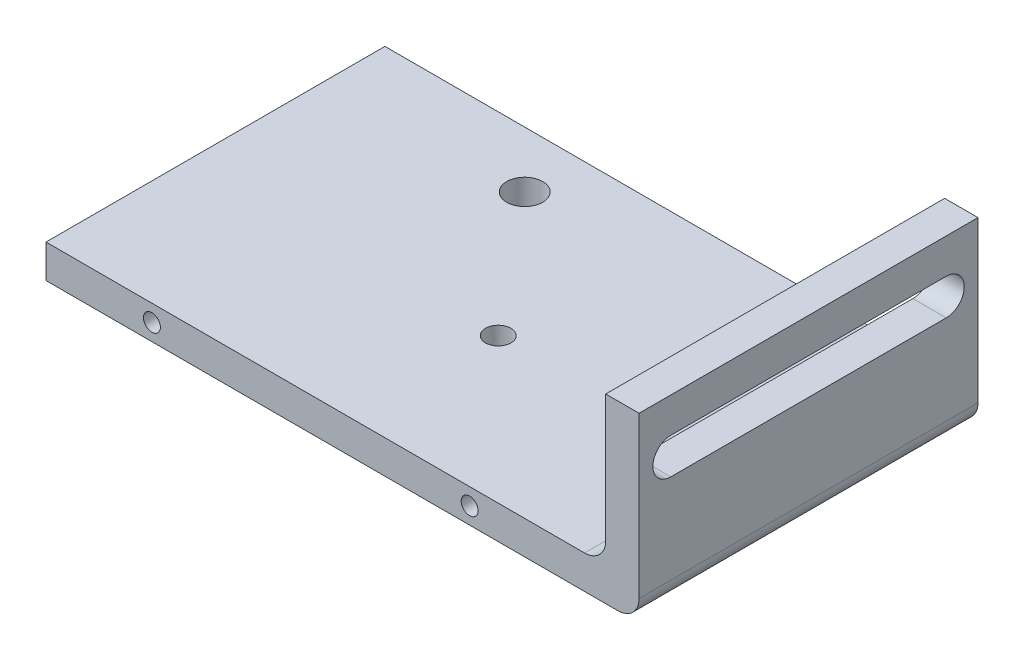
ISO-10303-21;
HEADER;
FILE_DESCRIPTION(('STEP AP214'),'2;1');
FILE_NAME('part.step','',(''),(''),'','','');
FILE_SCHEMA(('AUTOMOTIVE_DESIGN { 1 0 10303 214 1 1 1 1 }'));
ENDSEC;
DATA;
#1=APPLICATION_CONTEXT('core data for automotive mechanical design processes');
#2=APPLICATION_PROTOCOL_DEFINITION('international standard','automotive_design',2000,#1);
#3=PRODUCT_CONTEXT('',#1,'mechanical');
#4=PRODUCT('Part','Part','',(#3));
#5=PRODUCT_RELATED_PRODUCT_CATEGORY('part','',(#4));
#6=PRODUCT_DEFINITION_FORMATION('','',#4);
#7=PRODUCT_DEFINITION_CONTEXT('part definition',#1,'design');
#8=PRODUCT_DEFINITION('design','',#6,#7);
#9=PRODUCT_DEFINITION_SHAPE('','',#8);
#10=(LENGTH_UNIT() NAMED_UNIT(*) SI_UNIT(.MILLI.,.METRE.));
#11=(NAMED_UNIT(*) PLANE_ANGLE_UNIT() SI_UNIT($,.RADIAN.));
#12=(NAMED_UNIT(*) SI_UNIT($,.STERADIAN.) SOLID_ANGLE_UNIT());
#13=UNCERTAINTY_MEASURE_WITH_UNIT(LENGTH_MEASURE(1.E-05),#10,'distance_accuracy_value','');
#14=(GEOMETRIC_REPRESENTATION_CONTEXT(3) GLOBAL_UNCERTAINTY_ASSIGNED_CONTEXT((#13)) GLOBAL_UNIT_ASSIGNED_CONTEXT((#10,
#11,#12)) REPRESENTATION_CONTEXT('',''));
#15=CARTESIAN_POINT('',(0.,0.,0.));
#16=DIRECTION('',(0.,0.,1.));
#17=DIRECTION('',(1.,0.,0.));
#18=AXIS2_PLACEMENT_3D('',#15,#16,#17);
#19=CARTESIAN_POINT('',(-35.5,3.15,-16.));
#20=DIRECTION('',(0.,0.,1.));
#21=DIRECTION('',(1.,0.,0.));
#22=AXIS2_PLACEMENT_3D('',#19,#20,#21);
#23=PLANE('',#22);
#24=CARTESIAN_POINT('',(-10.5,1.575,-16.));
#25=DIRECTION('',(0.,0.,-1.));
#26=DIRECTION('',(-1.,0.,0.));
#27=AXIS2_PLACEMENT_3D('',#24,#25,#26);
#28=CIRCLE('',#27,0.79999999999999);
#29=CARTESIAN_POINT('',(-11.3,1.575,-16.));
#30=VERTEX_POINT('',#29);
#31=EDGE_CURVE('E153',#30,#30,#28,.T.);
#32=ORIENTED_EDGE('',*,*,#31,.F.);
#33=EDGE_LOOP('',(#32));
#34=FACE_BOUND('',#33,.T.);
#35=CARTESIAN_POINT('',(19.5,1.575,-16.));
#36=DIRECTION('',(0.,0.,-1.));
#37=DIRECTION('',(-1.,0.,0.));
#38=AXIS2_PLACEMENT_3D('',#35,#36,#37);
#39=CIRCLE('',#38,0.799999999999999);
#40=CARTESIAN_POINT('',(18.7,1.575,-16.));
#41=VERTEX_POINT('',#40);
#42=EDGE_CURVE('E184',#41,#41,#39,.T.);
#43=ORIENTED_EDGE('',*,*,#42,.F.);
#44=EDGE_LOOP('',(#43));
#45=FACE_BOUND('',#44,.T.);
#46=DIRECTION('',(0.,-1.,0.));
#47=VECTOR('',#46,1.);
#48=CARTESIAN_POINT('',(-20.5,3.15,-16.));
#49=LINE('',#48,#47);
#50=CARTESIAN_POINT('',(-20.5,3.15,-16.));
#51=VERTEX_POINT('',#50);
#52=CARTESIAN_POINT('',(-20.5,0.,-16.));
#53=VERTEX_POINT('',#52);
#54=EDGE_CURVE('E58',#51,#53,#49,.T.);
#55=ORIENTED_EDGE('',*,*,#54,.F.);
#56=DIRECTION('',(-1.,0.,0.));
#57=VECTOR('',#56,1.);
#58=CARTESIAN_POINT('',(-35.5,3.15,-16.));
#59=LINE('',#58,#57);
#60=CARTESIAN_POINT('',(30.35,3.15,-16.));
#61=VERTEX_POINT('',#60);
#62=EDGE_CURVE('E228',#61,#51,#59,.T.);
#63=ORIENTED_EDGE('',*,*,#62,.F.);
#64=CARTESIAN_POINT('',(30.35,5.15,-16.));
#65=DIRECTION('',(0.,0.,1.));
#66=DIRECTION('',(1.,0.,0.));
#67=AXIS2_PLACEMENT_3D('',#64,#65,#66);
#68=CIRCLE('',#67,2.);
#69=CARTESIAN_POINT('',(32.35,5.15,-16.));
#70=VERTEX_POINT('',#69);
#71=EDGE_CURVE('E250',#61,#70,#68,.T.);
#72=ORIENTED_EDGE('',*,*,#71,.T.);
#73=DIRECTION('',(0.,-1.,0.));
#74=VECTOR('',#73,1.);
#75=CARTESIAN_POINT('',(32.35,17.15,-16.));
#76=LINE('',#75,#74);
#77=CARTESIAN_POINT('',(32.35,17.15,-16.));
#78=VERTEX_POINT('',#77);
#79=EDGE_CURVE('E327',#78,#70,#76,.T.);
#80=ORIENTED_EDGE('',*,*,#79,.F.);
#81=DIRECTION('',(-1.,0.,0.));
#82=VECTOR('',#81,1.);
#83=CARTESIAN_POINT('',(35.5,17.15,-16.));
#84=LINE('',#83,#82);
#85=CARTESIAN_POINT('',(35.5,17.15,-16.));
#86=VERTEX_POINT('',#85);
#87=EDGE_CURVE('E219',#86,#78,#84,.T.);
#88=ORIENTED_EDGE('',*,*,#87,.F.);
#89=DIRECTION('',(0.,-1.,0.));
#90=VECTOR('',#89,1.);
#91=CARTESIAN_POINT('',(35.5,3.15,-16.));
#92=LINE('',#91,#90);
#93=CARTESIAN_POINT('',(35.5,2.,-16.));
#94=VERTEX_POINT('',#93);
#95=EDGE_CURVE('E339',#86,#94,#92,.T.);
#96=ORIENTED_EDGE('',*,*,#95,.T.);
#97=CARTESIAN_POINT('',(33.5,2.,-16.));
#98=DIRECTION('',(0.,0.,1.));
#99=DIRECTION('',(1.,0.,0.));
#100=AXIS2_PLACEMENT_3D('',#97,#98,#99);
#101=CIRCLE('',#100,2.);
#102=CARTESIAN_POINT('',(33.5,0.,-16.));
#103=VERTEX_POINT('',#102);
#104=EDGE_CURVE('E240',#94,#103,#101,.F.);
#105=ORIENTED_EDGE('',*,*,#104,.T.);
#106=DIRECTION('',(-1.,0.,0.));
#107=VECTOR('',#106,1.);
#108=CARTESIAN_POINT('',(-35.5,0.,-16.));
#109=LINE('',#108,#107);
#110=EDGE_CURVE('E331',#103,#53,#109,.T.);
#111=ORIENTED_EDGE('',*,*,#110,.T.);
#112=EDGE_LOOP('',(#55,#63,#72,#80,#88,#96,#105,#111));
#113=FACE_BOUND('',#112,.T.);
#114=ADVANCED_FACE('F41',(#34,#45,#113),#23,.F.);
#115=CARTESIAN_POINT('',(-35.5,3.15,16.));
#116=DIRECTION('',(0.,0.,-1.));
#117=DIRECTION('',(-1.,0.,0.));
#118=AXIS2_PLACEMENT_3D('',#115,#116,#117);
#119=PLANE('',#118);
#120=CARTESIAN_POINT('',(-10.5,1.575,16.));
#121=DIRECTION('',(0.,0.,1.));
#122=DIRECTION('',(1.,0.,0.));
#123=AXIS2_PLACEMENT_3D('',#120,#121,#122);
#124=CIRCLE('',#123,0.79999999999999);
#125=CARTESIAN_POINT('',(-9.70000000000003,1.575,16.));
#126=VERTEX_POINT('',#125);
#127=EDGE_CURVE('E154',#126,#126,#124,.T.);
#128=ORIENTED_EDGE('',*,*,#127,.F.);
#129=EDGE_LOOP('',(#128));
#130=FACE_BOUND('',#129,.T.);
#131=CARTESIAN_POINT('',(19.5,1.575,16.));
#132=DIRECTION('',(0.,0.,1.));
#133=DIRECTION('',(1.,0.,0.));
#134=AXIS2_PLACEMENT_3D('',#131,#132,#133);
#135=CIRCLE('',#134,0.799999999999999);
#136=CARTESIAN_POINT('',(20.3,1.575,16.));
#137=VERTEX_POINT('',#136);
#138=EDGE_CURVE('E195',#137,#137,#135,.T.);
#139=ORIENTED_EDGE('',*,*,#138,.F.);
#140=EDGE_LOOP('',(#139));
#141=FACE_BOUND('',#140,.T.);
#142=DIRECTION('',(0.,1.,0.));
#143=VECTOR('',#142,1.);
#144=CARTESIAN_POINT('',(-20.5,3.15,16.));
#145=LINE('',#144,#143);
#146=CARTESIAN_POINT('',(-20.5,0.,16.));
#147=VERTEX_POINT('',#146);
#148=CARTESIAN_POINT('',(-20.5,3.15,16.));
#149=VERTEX_POINT('',#148);
#150=EDGE_CURVE('E167',#147,#149,#145,.T.);
#151=ORIENTED_EDGE('',*,*,#150,.F.);
#152=DIRECTION('',(1.,0.,0.));
#153=VECTOR('',#152,1.);
#154=CARTESIAN_POINT('',(-35.5,0.,16.));
#155=LINE('',#154,#153);
#156=CARTESIAN_POINT('',(33.5,0.,16.));
#157=VERTEX_POINT('',#156);
#158=EDGE_CURVE('E232',#147,#157,#155,.T.);
#159=ORIENTED_EDGE('',*,*,#158,.T.);
#160=CARTESIAN_POINT('',(33.5,2.,16.));
#161=DIRECTION('',(0.,0.,-1.));
#162=DIRECTION('',(-1.,0.,0.));
#163=AXIS2_PLACEMENT_3D('',#160,#161,#162);
#164=CIRCLE('',#163,2.);
#165=CARTESIAN_POINT('',(35.5,2.,16.));
#166=VERTEX_POINT('',#165);
#167=EDGE_CURVE('E245',#157,#166,#164,.F.);
#168=ORIENTED_EDGE('',*,*,#167,.T.);
#169=DIRECTION('',(0.,-1.,0.));
#170=VECTOR('',#169,1.);
#171=CARTESIAN_POINT('',(35.5,3.15,16.));
#172=LINE('',#171,#170);
#173=CARTESIAN_POINT('',(35.5,17.15,16.));
#174=VERTEX_POINT('',#173);
#175=EDGE_CURVE('E342',#174,#166,#172,.T.);
#176=ORIENTED_EDGE('',*,*,#175,.F.);
#177=DIRECTION('',(1.,0.,0.));
#178=VECTOR('',#177,1.);
#179=CARTESIAN_POINT('',(35.5,17.15,16.));
#180=LINE('',#179,#178);
#181=CARTESIAN_POINT('',(32.35,17.15,16.));
#182=VERTEX_POINT('',#181);
#183=EDGE_CURVE('E213',#182,#174,#180,.T.);
#184=ORIENTED_EDGE('',*,*,#183,.F.);
#185=DIRECTION('',(0.,-1.,0.));
#186=VECTOR('',#185,1.);
#187=CARTESIAN_POINT('',(32.35,17.15,16.));
#188=LINE('',#187,#186);
#189=CARTESIAN_POINT('',(32.35,5.15,16.));
#190=VERTEX_POINT('',#189);
#191=EDGE_CURVE('E223',#182,#190,#188,.T.);
#192=ORIENTED_EDGE('',*,*,#191,.T.);
#193=CARTESIAN_POINT('',(30.35,5.15,16.));
#194=DIRECTION('',(0.,0.,-1.));
#195=DIRECTION('',(-1.,0.,0.));
#196=AXIS2_PLACEMENT_3D('',#193,#194,#195);
#197=CIRCLE('',#196,2.);
#198=CARTESIAN_POINT('',(30.35,3.15,16.));
#199=VERTEX_POINT('',#198);
#200=EDGE_CURVE('E247',#190,#199,#197,.T.);
#201=ORIENTED_EDGE('',*,*,#200,.T.);
#202=DIRECTION('',(1.,0.,0.));
#203=VECTOR('',#202,1.);
#204=CARTESIAN_POINT('',(-35.5,3.15,16.));
#205=LINE('',#204,#203);
#206=EDGE_CURVE('E45',#149,#199,#205,.T.);
#207=ORIENTED_EDGE('',*,*,#206,.F.);
#208=EDGE_LOOP('',(#151,#159,#168,#176,#184,#192,#201,#207));
#209=FACE_BOUND('',#208,.T.);
#210=ADVANCED_FACE('F291',(#130,#141,#209),#119,.F.);
#211=CARTESIAN_POINT('',(0.,3.15,0.));
#212=DIRECTION('',(0.,1.,0.));
#213=DIRECTION('',(0.,0.,1.));
#214=AXIS2_PLACEMENT_3D('',#211,#212,#213);
#215=PLANE('',#214);
#216=CARTESIAN_POINT('',(-2.00000000000002,3.15,-10.7));
#217=DIRECTION('',(0.,1.,0.));
#218=DIRECTION('',(0.,0.,1.));
#219=AXIS2_PLACEMENT_3D('',#216,#217,#218);
#220=CIRCLE('',#219,1.7);
#221=CARTESIAN_POINT('',(-2.00000000000002,3.15,-9.));
#222=VERTEX_POINT('',#221);
#223=EDGE_CURVE('E210',#222,#222,#220,.T.);
#224=ORIENTED_EDGE('',*,*,#223,.F.);
#225=EDGE_LOOP('',(#224));
#226=FACE_BOUND('',#225,.T.);
#227=CARTESIAN_POINT('',(8.49999999999999,3.15,2.3));
#228=DIRECTION('',(0.,1.,0.));
#229=DIRECTION('',(0.,0.,1.));
#230=AXIS2_PLACEMENT_3D('',#227,#228,#229);
#231=CIRCLE('',#230,1.2);
#232=CARTESIAN_POINT('',(8.49999999999999,3.15,3.5));
#233=VERTEX_POINT('',#232);
#234=EDGE_CURVE('E204',#233,#233,#231,.T.);
#235=ORIENTED_EDGE('',*,*,#234,.F.);
#236=EDGE_LOOP('',(#235));
#237=FACE_BOUND('',#236,.T.);
#238=ORIENTED_EDGE('',*,*,#62,.T.);
#239=DIRECTION('',(0.,0.,-1.));
#240=VECTOR('',#239,1.);
#241=CARTESIAN_POINT('',(-20.5,3.15,-16.));
#242=LINE('',#241,#240);
#243=EDGE_CURVE('E169',#149,#51,#242,.T.);
#244=ORIENTED_EDGE('',*,*,#243,.F.);
#245=ORIENTED_EDGE('',*,*,#206,.T.);
#246=DIRECTION('',(0.,0.,1.));
#247=VECTOR('',#246,1.);
#248=CARTESIAN_POINT('',(30.35,3.15,0.));
#249=LINE('',#248,#247);
#250=EDGE_CURVE('E235',#199,#61,#249,.F.);
#251=ORIENTED_EDGE('',*,*,#250,.T.);
#252=EDGE_LOOP('',(#238,#244,#245,#251));
#253=FACE_BOUND('',#252,.T.);
#254=ADVANCED_FACE('F297',(#226,#237,#253),#215,.T.);
#255=CARTESIAN_POINT('',(0.,0.,0.));
#256=DIRECTION('',(0.,1.,0.));
#257=DIRECTION('',(0.,0.,1.));
#258=AXIS2_PLACEMENT_3D('',#255,#256,#257);
#259=PLANE('',#258);
#260=CARTESIAN_POINT('',(-2.00000000000002,0.,-10.7));
#261=DIRECTION('',(0.,-1.,0.));
#262=DIRECTION('',(0.,0.,-1.));
#263=AXIS2_PLACEMENT_3D('',#260,#261,#262);
#264=CIRCLE('',#263,1.7);
#265=CARTESIAN_POINT('',(-2.00000000000002,0.,-12.4));
#266=VERTEX_POINT('',#265);
#267=EDGE_CURVE('E207',#266,#266,#264,.T.);
#268=ORIENTED_EDGE('',*,*,#267,.F.);
#269=EDGE_LOOP('',(#268));
#270=FACE_BOUND('',#269,.T.);
#271=CARTESIAN_POINT('',(8.49999999999999,0.,2.3));
#272=DIRECTION('',(0.,-1.,0.));
#273=DIRECTION('',(0.,0.,-1.));
#274=AXIS2_PLACEMENT_3D('',#271,#272,#273);
#275=CIRCLE('',#274,1.2);
#276=CARTESIAN_POINT('',(8.49999999999999,0.,1.1));
#277=VERTEX_POINT('',#276);
#278=EDGE_CURVE('E201',#277,#277,#275,.T.);
#279=ORIENTED_EDGE('',*,*,#278,.F.);
#280=EDGE_LOOP('',(#279));
#281=FACE_BOUND('',#280,.T.);
#282=DIRECTION('',(0.,0.,1.));
#283=VECTOR('',#282,1.);
#284=CARTESIAN_POINT('',(-20.5,0.,-16.));
#285=LINE('',#284,#283);
#286=EDGE_CURVE('E165',#53,#147,#285,.T.);
#287=ORIENTED_EDGE('',*,*,#286,.F.);
#288=ORIENTED_EDGE('',*,*,#110,.F.);
#289=DIRECTION('',(0.,0.,-1.));
#290=VECTOR('',#289,1.);
#291=CARTESIAN_POINT('',(33.5,0.,0.));
#292=LINE('',#291,#290);
#293=EDGE_CURVE('E242',#103,#157,#292,.F.);
#294=ORIENTED_EDGE('',*,*,#293,.T.);
#295=ORIENTED_EDGE('',*,*,#158,.F.);
#296=EDGE_LOOP('',(#287,#288,#294,#295));
#297=FACE_BOUND('',#296,.T.);
#298=ADVANCED_FACE('F305',(#270,#281,#297),#259,.F.);
#299=CARTESIAN_POINT('',(35.5,3.15,-16.));
#300=DIRECTION('',(-1.,0.,0.));
#301=DIRECTION('',(0.,0.,1.));
#302=AXIS2_PLACEMENT_3D('',#299,#300,#301);
#303=PLANE('',#302);
#304=DIRECTION('',(0.,0.,-1.));
#305=VECTOR('',#304,1.);
#306=CARTESIAN_POINT('',(35.5,10.45,13.));
#307=LINE('',#306,#305);
#308=CARTESIAN_POINT('',(35.5,10.45,13.));
#309=VERTEX_POINT('',#308);
#310=CARTESIAN_POINT('',(35.5,10.45,-13.));
#311=VERTEX_POINT('',#310);
#312=EDGE_CURVE('E172',#309,#311,#307,.T.);
#313=ORIENTED_EDGE('',*,*,#312,.F.);
#314=CARTESIAN_POINT('',(35.5,12.15,13.));
#315=DIRECTION('',(1.,0.,0.));
#316=DIRECTION('',(0.,0.,-1.));
#317=AXIS2_PLACEMENT_3D('',#314,#315,#316);
#318=CIRCLE('',#317,1.7);
#319=CARTESIAN_POINT('',(35.5,13.85,13.));
#320=VERTEX_POINT('',#319);
#321=EDGE_CURVE('E66',#320,#309,#318,.T.);
#322=ORIENTED_EDGE('',*,*,#321,.F.);
#323=DIRECTION('',(0.,0.,1.));
#324=VECTOR('',#323,1.);
#325=CARTESIAN_POINT('',(35.5,13.85,13.));
#326=LINE('',#325,#324);
#327=CARTESIAN_POINT('',(35.5,13.85,-13.));
#328=VERTEX_POINT('',#327);
#329=EDGE_CURVE('E178',#328,#320,#326,.T.);
#330=ORIENTED_EDGE('',*,*,#329,.F.);
#331=CARTESIAN_POINT('',(35.5,12.15,-13.));
#332=DIRECTION('',(1.,0.,0.));
#333=DIRECTION('',(0.,0.,-1.));
#334=AXIS2_PLACEMENT_3D('',#331,#332,#333);
#335=CIRCLE('',#334,1.7);
#336=EDGE_CURVE('E175',#311,#328,#335,.T.);
#337=ORIENTED_EDGE('',*,*,#336,.F.);
#338=EDGE_LOOP('',(#313,#322,#330,#337));
#339=FACE_BOUND('',#338,.T.);
#340=ORIENTED_EDGE('',*,*,#175,.T.);
#341=DIRECTION('',(0.,0.,-1.));
#342=VECTOR('',#341,1.);
#343=CARTESIAN_POINT('',(35.5,2.,-16.));
#344=LINE('',#343,#342);
#345=EDGE_CURVE('E237',#166,#94,#344,.T.);
#346=ORIENTED_EDGE('',*,*,#345,.T.);
#347=ORIENTED_EDGE('',*,*,#95,.F.);
#348=DIRECTION('',(0.,0.,-1.));
#349=VECTOR('',#348,1.);
#350=CARTESIAN_POINT('',(35.5,17.15,16.));
#351=LINE('',#350,#349);
#352=EDGE_CURVE('E216',#174,#86,#351,.T.);
#353=ORIENTED_EDGE('',*,*,#352,.F.);
#354=EDGE_LOOP('',(#340,#346,#347,#353));
#355=FACE_BOUND('',#354,.T.);
#356=ADVANCED_FACE('F273',(#339,#355),#303,.F.);
#357=CARTESIAN_POINT('',(32.35,17.15,16.));
#358=DIRECTION('',(1.,0.,0.));
#359=DIRECTION('',(0.,0.,-1.));
#360=AXIS2_PLACEMENT_3D('',#357,#358,#359);
#361=PLANE('',#360);
#362=DIRECTION('',(0.,0.,1.));
#363=VECTOR('',#362,1.);
#364=CARTESIAN_POINT('',(32.35,13.85,16.));
#365=LINE('',#364,#363);
#366=CARTESIAN_POINT('',(32.35,13.85,-13.));
#367=VERTEX_POINT('',#366);
#368=CARTESIAN_POINT('',(32.35,13.85,13.));
#369=VERTEX_POINT('',#368);
#370=EDGE_CURVE('E51',#367,#369,#365,.T.);
#371=ORIENTED_EDGE('',*,*,#370,.T.);
#372=CARTESIAN_POINT('',(32.35,12.15,13.));
#373=DIRECTION('',(1.,0.,0.));
#374=DIRECTION('',(0.,0.,-1.));
#375=AXIS2_PLACEMENT_3D('',#372,#373,#374);
#376=CIRCLE('',#375,1.7);
#377=CARTESIAN_POINT('',(32.35,10.45,13.));
#378=VERTEX_POINT('',#377);
#379=EDGE_CURVE('E11',#369,#378,#376,.T.);
#380=ORIENTED_EDGE('',*,*,#379,.T.);
#381=DIRECTION('',(0.,0.,-1.));
#382=VECTOR('',#381,1.);
#383=CARTESIAN_POINT('',(32.35,10.45,16.));
#384=LINE('',#383,#382);
#385=CARTESIAN_POINT('',(32.35,10.45,-13.));
#386=VERTEX_POINT('',#385);
#387=EDGE_CURVE('E252',#378,#386,#384,.T.);
#388=ORIENTED_EDGE('',*,*,#387,.T.);
#389=CARTESIAN_POINT('',(32.35,12.15,-13.));
#390=DIRECTION('',(1.,0.,0.));
#391=DIRECTION('',(0.,0.,-1.));
#392=AXIS2_PLACEMENT_3D('',#389,#390,#391);
#393=CIRCLE('',#392,1.7);
#394=EDGE_CURVE('E255',#386,#367,#393,.T.);
#395=ORIENTED_EDGE('',*,*,#394,.T.);
#396=EDGE_LOOP('',(#371,#380,#388,#395));
#397=FACE_BOUND('',#396,.T.);
#398=ORIENTED_EDGE('',*,*,#79,.T.);
#399=DIRECTION('',(0.,0.,1.));
#400=VECTOR('',#399,1.);
#401=CARTESIAN_POINT('',(32.35,5.15,16.));
#402=LINE('',#401,#400);
#403=EDGE_CURVE('E233',#70,#190,#402,.T.);
#404=ORIENTED_EDGE('',*,*,#403,.T.);
#405=ORIENTED_EDGE('',*,*,#191,.F.);
#406=DIRECTION('',(0.,0.,1.));
#407=VECTOR('',#406,1.);
#408=CARTESIAN_POINT('',(32.35,17.15,16.));
#409=LINE('',#408,#407);
#410=EDGE_CURVE('E221',#78,#182,#409,.T.);
#411=ORIENTED_EDGE('',*,*,#410,.F.);
#412=EDGE_LOOP('',(#398,#404,#405,#411));
#413=FACE_BOUND('',#412,.T.);
#414=ADVANCED_FACE('F260',(#397,#413),#361,.F.);
#415=CARTESIAN_POINT('',(0.,17.15,0.));
#416=DIRECTION('',(0.,-1.,0.));
#417=DIRECTION('',(0.,0.,-1.));
#418=AXIS2_PLACEMENT_3D('',#415,#416,#417);
#419=PLANE('',#418);
#420=ORIENTED_EDGE('',*,*,#183,.T.);
#421=ORIENTED_EDGE('',*,*,#352,.T.);
#422=ORIENTED_EDGE('',*,*,#87,.T.);
#423=ORIENTED_EDGE('',*,*,#410,.T.);
#424=EDGE_LOOP('',(#420,#421,#422,#423));
#425=FACE_BOUND('',#424,.T.);
#426=ADVANCED_FACE('F308',(#425),#419,.F.);
#427=CARTESIAN_POINT('',(30.35,5.15,16.));
#428=DIRECTION('',(0.,0.,1.));
#429=DIRECTION('',(1.,0.,0.));
#430=AXIS2_PLACEMENT_3D('',#427,#428,#429);
#431=CYLINDRICAL_SURFACE('',#430,2.);
#432=ORIENTED_EDGE('',*,*,#71,.F.);
#433=ORIENTED_EDGE('',*,*,#250,.F.);
#434=ORIENTED_EDGE('',*,*,#200,.F.);
#435=ORIENTED_EDGE('',*,*,#403,.F.);
#436=EDGE_LOOP('',(#432,#433,#434,#435));
#437=FACE_BOUND('',#436,.T.);
#438=ADVANCED_FACE('F306',(#437),#431,.F.);
#439=CARTESIAN_POINT('',(33.5,2.,-16.));
#440=DIRECTION('',(0.,0.,-1.));
#441=DIRECTION('',(-1.,0.,0.));
#442=AXIS2_PLACEMENT_3D('',#439,#440,#441);
#443=CYLINDRICAL_SURFACE('',#442,2.);
#444=ORIENTED_EDGE('',*,*,#167,.F.);
#445=ORIENTED_EDGE('',*,*,#293,.F.);
#446=ORIENTED_EDGE('',*,*,#104,.F.);
#447=ORIENTED_EDGE('',*,*,#345,.F.);
#448=EDGE_LOOP('',(#444,#445,#446,#447));
#449=FACE_BOUND('',#448,.T.);
#450=ADVANCED_FACE('F43',(#449),#443,.T.);
#451=CARTESIAN_POINT('',(-2.00000000000002,17.15,-10.7));
#452=DIRECTION('',(0.,-1.,0.));
#453=DIRECTION('',(0.,0.,-1.));
#454=AXIS2_PLACEMENT_3D('',#451,#452,#453);
#455=CYLINDRICAL_SURFACE('',#454,1.7);
#456=ORIENTED_EDGE('',*,*,#223,.T.);
#457=EDGE_LOOP('',(#456));
#458=FACE_BOUND('',#457,.T.);
#459=ORIENTED_EDGE('',*,*,#267,.T.);
#460=EDGE_LOOP('',(#459));
#461=FACE_BOUND('',#460,.T.);
#462=ADVANCED_FACE('F314',(#458,#461),#455,.F.);
#463=CARTESIAN_POINT('',(8.49999999999999,17.15,2.3));
#464=DIRECTION('',(0.,-1.,0.));
#465=DIRECTION('',(0.,0.,-1.));
#466=AXIS2_PLACEMENT_3D('',#463,#464,#465);
#467=CYLINDRICAL_SURFACE('',#466,1.2);
#468=ORIENTED_EDGE('',*,*,#234,.T.);
#469=EDGE_LOOP('',(#468));
#470=FACE_BOUND('',#469,.T.);
#471=ORIENTED_EDGE('',*,*,#278,.T.);
#472=EDGE_LOOP('',(#471));
#473=FACE_BOUND('',#472,.T.);
#474=ADVANCED_FACE('F534',(#470,#473),#467,.F.);
#475=CARTESIAN_POINT('',(19.5,1.575,10.8));
#476=DIRECTION('',(0.,0.,1.));
#477=DIRECTION('',(1.,0.,0.));
#478=AXIS2_PLACEMENT_3D('',#475,#476,#477);
#479=CONICAL_SURFACE('',#478,0.799999999999999,1.02974425867665);
#480=CARTESIAN_POINT('',(19.5,1.575,10.319311504778));
#481=VERTEX_POINT('',#480);
#482=VERTEX_LOOP('',#481);
#483=FACE_BOUND('',#482,.T.);
#484=CARTESIAN_POINT('',(19.5,1.575,10.8));
#485=DIRECTION('',(0.,0.,1.));
#486=DIRECTION('',(1.,0.,0.));
#487=AXIS2_PLACEMENT_3D('',#484,#485,#486);
#488=CIRCLE('',#487,0.799999999999999);
#489=CARTESIAN_POINT('',(20.3,1.575,10.8));
#490=VERTEX_POINT('',#489);
#491=EDGE_CURVE('E198',#490,#490,#488,.T.);
#492=ORIENTED_EDGE('',*,*,#491,.T.);
#493=EDGE_LOOP('',(#492));
#494=FACE_BOUND('',#493,.T.);
#495=ADVANCED_FACE('F462',(#483,#494),#479,.F.);
#496=CARTESIAN_POINT('',(19.5,1.575,16.));
#497=DIRECTION('',(0.,0.,1.));
#498=DIRECTION('',(1.,0.,0.));
#499=AXIS2_PLACEMENT_3D('',#496,#497,#498);
#500=CYLINDRICAL_SURFACE('',#499,0.799999999999999);
#501=ORIENTED_EDGE('',*,*,#491,.F.);
#502=EDGE_LOOP('',(#501));
#503=FACE_BOUND('',#502,.T.);
#504=ORIENTED_EDGE('',*,*,#138,.T.);
#505=EDGE_LOOP('',(#504));
#506=FACE_BOUND('',#505,.T.);
#507=ADVANCED_FACE('F458',(#503,#506),#500,.F.);
#508=CARTESIAN_POINT('',(19.5,1.575,-10.8));
#509=DIRECTION('',(0.,0.,-1.));
#510=DIRECTION('',(-1.,0.,0.));
#511=AXIS2_PLACEMENT_3D('',#508,#509,#510);
#512=CONICAL_SURFACE('',#511,0.799999999999999,1.02974425867665);
#513=CARTESIAN_POINT('',(19.5,1.575,-10.319311504778));
#514=VERTEX_POINT('',#513);
#515=VERTEX_LOOP('',#514);
#516=FACE_BOUND('',#515,.T.);
#517=CARTESIAN_POINT('',(19.5,1.575,-10.8));
#518=DIRECTION('',(0.,0.,-1.));
#519=DIRECTION('',(-1.,0.,0.));
#520=AXIS2_PLACEMENT_3D('',#517,#518,#519);
#521=CIRCLE('',#520,0.799999999999999);
#522=CARTESIAN_POINT('',(18.7,1.575,-10.8));
#523=VERTEX_POINT('',#522);
#524=EDGE_CURVE('E192',#523,#523,#521,.T.);
#525=ORIENTED_EDGE('',*,*,#524,.T.);
#526=EDGE_LOOP('',(#525));
#527=FACE_BOUND('',#526,.T.);
#528=ADVANCED_FACE('F286',(#516,#527),#512,.F.);
#529=CARTESIAN_POINT('',(19.5,1.575,-16.));
#530=DIRECTION('',(0.,0.,-1.));
#531=DIRECTION('',(-1.,0.,0.));
#532=AXIS2_PLACEMENT_3D('',#529,#530,#531);
#533=CYLINDRICAL_SURFACE('',#532,0.799999999999999);
#534=ORIENTED_EDGE('',*,*,#524,.F.);
#535=EDGE_LOOP('',(#534));
#536=FACE_BOUND('',#535,.T.);
#537=ORIENTED_EDGE('',*,*,#42,.T.);
#538=EDGE_LOOP('',(#537));
#539=FACE_BOUND('',#538,.T.);
#540=ADVANCED_FACE('F279',(#536,#539),#533,.F.);
#541=CARTESIAN_POINT('',(-35.5,12.15,13.));
#542=DIRECTION('',(1.,0.,0.));
#543=DIRECTION('',(0.,0.,-1.));
#544=AXIS2_PLACEMENT_3D('',#541,#542,#543);
#545=CYLINDRICAL_SURFACE('',#544,1.7);
#546=DIRECTION('',(1.,0.,0.));
#547=VECTOR('',#546,1.);
#548=CARTESIAN_POINT('',(-35.5,13.85,13.));
#549=LINE('',#548,#547);
#550=EDGE_CURVE('E182',#369,#320,#549,.T.);
#551=ORIENTED_EDGE('',*,*,#550,.T.);
#552=ORIENTED_EDGE('',*,*,#321,.T.);
#553=DIRECTION('',(1.,0.,0.));
#554=VECTOR('',#553,1.);
#555=CARTESIAN_POINT('',(-35.5,10.45,13.));
#556=LINE('',#555,#554);
#557=EDGE_CURVE('E181',#378,#309,#556,.T.);
#558=ORIENTED_EDGE('',*,*,#557,.F.);
#559=ORIENTED_EDGE('',*,*,#379,.F.);
#560=EDGE_LOOP('',(#551,#552,#558,#559));
#561=FACE_BOUND('',#560,.T.);
#562=ADVANCED_FACE('F277',(#561),#545,.F.);
#563=CARTESIAN_POINT('',(-35.5,13.85,13.));
#564=DIRECTION('',(0.,1.,0.));
#565=DIRECTION('',(0.,0.,1.));
#566=AXIS2_PLACEMENT_3D('',#563,#564,#565);
#567=PLANE('',#566);
#568=DIRECTION('',(1.,0.,0.));
#569=VECTOR('',#568,1.);
#570=CARTESIAN_POINT('',(-35.5,13.85,-13.));
#571=LINE('',#570,#569);
#572=EDGE_CURVE('E185',#367,#328,#571,.T.);
#573=ORIENTED_EDGE('',*,*,#572,.T.);
#574=ORIENTED_EDGE('',*,*,#329,.T.);
#575=ORIENTED_EDGE('',*,*,#550,.F.);
#576=ORIENTED_EDGE('',*,*,#370,.F.);
#577=EDGE_LOOP('',(#573,#574,#575,#576));
#578=FACE_BOUND('',#577,.T.);
#579=ADVANCED_FACE('F266',(#578),#567,.F.);
#580=CARTESIAN_POINT('',(-35.5,12.15,-13.));
#581=DIRECTION('',(1.,0.,0.));
#582=DIRECTION('',(0.,0.,-1.));
#583=AXIS2_PLACEMENT_3D('',#580,#581,#582);
#584=CYLINDRICAL_SURFACE('',#583,1.7);
#585=DIRECTION('',(1.,0.,0.));
#586=VECTOR('',#585,1.);
#587=CARTESIAN_POINT('',(-35.5,10.45,-13.));
#588=LINE('',#587,#586);
#589=EDGE_CURVE('E187',#386,#311,#588,.T.);
#590=ORIENTED_EDGE('',*,*,#589,.T.);
#591=ORIENTED_EDGE('',*,*,#336,.T.);
#592=ORIENTED_EDGE('',*,*,#572,.F.);
#593=ORIENTED_EDGE('',*,*,#394,.F.);
#594=EDGE_LOOP('',(#590,#591,#592,#593));
#595=FACE_BOUND('',#594,.T.);
#596=ADVANCED_FACE('F268',(#595),#584,.F.);
#597=CARTESIAN_POINT('',(-35.5,10.45,13.));
#598=DIRECTION('',(0.,-1.,0.));
#599=DIRECTION('',(0.,0.,-1.));
#600=AXIS2_PLACEMENT_3D('',#597,#598,#599);
#601=PLANE('',#600);
#602=ORIENTED_EDGE('',*,*,#557,.T.);
#603=ORIENTED_EDGE('',*,*,#312,.T.);
#604=ORIENTED_EDGE('',*,*,#589,.F.);
#605=ORIENTED_EDGE('',*,*,#387,.F.);
#606=EDGE_LOOP('',(#602,#603,#604,#605));
#607=FACE_BOUND('',#606,.T.);
#608=ADVANCED_FACE('F276',(#607),#601,.F.);
#609=CARTESIAN_POINT('',(-20.5,0.,0.));
#610=DIRECTION('',(-1.,0.,0.));
#611=DIRECTION('',(0.,0.,1.));
#612=AXIS2_PLACEMENT_3D('',#609,#610,#611);
#613=PLANE('',#612);
#614=ORIENTED_EDGE('',*,*,#54,.T.);
#615=ORIENTED_EDGE('',*,*,#286,.T.);
#616=ORIENTED_EDGE('',*,*,#150,.T.);
#617=ORIENTED_EDGE('',*,*,#243,.T.);
#618=EDGE_LOOP('',(#614,#615,#616,#617));
#619=FACE_BOUND('',#618,.T.);
#620=ADVANCED_FACE('F358',(#619),#613,.T.);
#621=CARTESIAN_POINT('',(-10.5,1.575,-12.));
#622=DIRECTION('',(0.,0.,-1.));
#623=DIRECTION('',(-1.,0.,0.));
#624=AXIS2_PLACEMENT_3D('',#621,#622,#623);
#625=CONICAL_SURFACE('',#624,0.799999999999999,1.02974425867665);
#626=CARTESIAN_POINT('',(-10.5,1.575,-11.519311504778));
#627=VERTEX_POINT('',#626);
#628=VERTEX_LOOP('',#627);
#629=FACE_BOUND('',#628,.T.);
#630=CARTESIAN_POINT('',(-10.5,1.575,-12.));
#631=DIRECTION('',(0.,0.,-1.));
#632=DIRECTION('',(-1.,0.,0.));
#633=AXIS2_PLACEMENT_3D('',#630,#631,#632);
#634=CIRCLE('',#633,0.799999999999999);
#635=CARTESIAN_POINT('',(-11.3,1.575,-12.));
#636=VERTEX_POINT('',#635);
#637=EDGE_CURVE('E157',#636,#636,#634,.T.);
#638=ORIENTED_EDGE('',*,*,#637,.T.);
#639=EDGE_LOOP('',(#638));
#640=FACE_BOUND('',#639,.T.);
#641=ADVANCED_FACE('F360',(#629,#640),#625,.F.);
#642=CARTESIAN_POINT('',(-10.5,1.575,-16.));
#643=DIRECTION('',(0.,0.,-1.));
#644=DIRECTION('',(-1.,0.,0.));
#645=AXIS2_PLACEMENT_3D('',#642,#643,#644);
#646=CYLINDRICAL_SURFACE('',#645,0.799999999999994);
#647=ORIENTED_EDGE('',*,*,#637,.F.);
#648=EDGE_LOOP('',(#647));
#649=FACE_BOUND('',#648,.T.);
#650=ORIENTED_EDGE('',*,*,#31,.T.);
#651=EDGE_LOOP('',(#650));
#652=FACE_BOUND('',#651,.T.);
#653=ADVANCED_FACE('F147',(#649,#652),#646,.F.);
#654=CARTESIAN_POINT('',(-10.5,1.575,12.));
#655=DIRECTION('',(0.,0.,1.));
#656=DIRECTION('',(1.,0.,0.));
#657=AXIS2_PLACEMENT_3D('',#654,#655,#656);
#658=CONICAL_SURFACE('',#657,0.799999999999999,1.02974425867665);
#659=CARTESIAN_POINT('',(-10.5,1.575,11.519311504778));
#660=VERTEX_POINT('',#659);
#661=VERTEX_LOOP('',#660);
#662=FACE_BOUND('',#661,.T.);
#663=CARTESIAN_POINT('',(-10.5,1.575,12.));
#664=DIRECTION('',(0.,0.,1.));
#665=DIRECTION('',(1.,0.,0.));
#666=AXIS2_PLACEMENT_3D('',#663,#664,#665);
#667=CIRCLE('',#666,0.799999999999999);
#668=CARTESIAN_POINT('',(-9.70000000000002,1.575,12.));
#669=VERTEX_POINT('',#668);
#670=EDGE_CURVE('E151',#669,#669,#667,.T.);
#671=ORIENTED_EDGE('',*,*,#670,.T.);
#672=EDGE_LOOP('',(#671));
#673=FACE_BOUND('',#672,.T.);
#674=ADVANCED_FACE('F143',(#662,#673),#658,.F.);
#675=CARTESIAN_POINT('',(-10.5,1.575,16.));
#676=DIRECTION('',(0.,0.,1.));
#677=DIRECTION('',(1.,0.,0.));
#678=AXIS2_PLACEMENT_3D('',#675,#676,#677);
#679=CYLINDRICAL_SURFACE('',#678,0.799999999999994);
#680=ORIENTED_EDGE('',*,*,#670,.F.);
#681=EDGE_LOOP('',(#680));
#682=FACE_BOUND('',#681,.T.);
#683=ORIENTED_EDGE('',*,*,#127,.T.);
#684=EDGE_LOOP('',(#683));
#685=FACE_BOUND('',#684,.T.);
#686=ADVANCED_FACE('F146',(#682,#685),#679,.F.);
#687=CLOSED_SHELL('',(#114,#210,#254,#298,#356,#414,#426,#438,#450,#462,#474,#495,#507,#528,
#540,#562,#579,#596,#608,#620,#641,#653,#674,#686));
#688=MANIFOLD_SOLID_BREP('B2',#687);
#689=ADVANCED_BREP_SHAPE_REPRESENTATION('',(#18,#688),#14);
#690=SHAPE_DEFINITION_REPRESENTATION(#9,#689);
ENDSEC;
END-ISO-10303-21;
